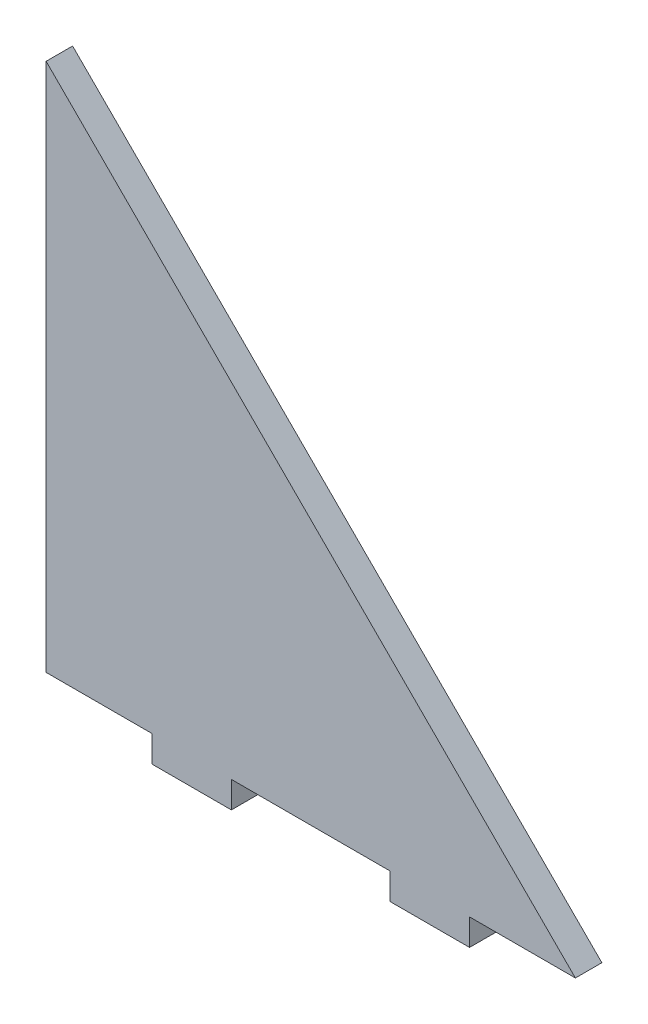
ISO-10303-21;
HEADER;
FILE_DESCRIPTION(('STEP AP214'),'2;1');
FILE_NAME('part.step','',(''),(''),'','','');
FILE_SCHEMA(('AUTOMOTIVE_DESIGN { 1 0 10303 214 1 1 1 1 }'));
ENDSEC;
DATA;
#1=APPLICATION_CONTEXT('core data for automotive mechanical design processes');
#2=APPLICATION_PROTOCOL_DEFINITION('international standard','automotive_design',2000,#1);
#3=PRODUCT_CONTEXT('',#1,'mechanical');
#4=PRODUCT('Part','Part','',(#3));
#5=PRODUCT_RELATED_PRODUCT_CATEGORY('part','',(#4));
#6=PRODUCT_DEFINITION_FORMATION('','',#4);
#7=PRODUCT_DEFINITION_CONTEXT('part definition',#1,'design');
#8=PRODUCT_DEFINITION('design','',#6,#7);
#9=PRODUCT_DEFINITION_SHAPE('','',#8);
#10=(LENGTH_UNIT() NAMED_UNIT(*) SI_UNIT(.MILLI.,.METRE.));
#11=(NAMED_UNIT(*) PLANE_ANGLE_UNIT() SI_UNIT($,.RADIAN.));
#12=(NAMED_UNIT(*) SI_UNIT($,.STERADIAN.) SOLID_ANGLE_UNIT());
#13=UNCERTAINTY_MEASURE_WITH_UNIT(LENGTH_MEASURE(1.E-05),#10,'distance_accuracy_value','');
#14=(GEOMETRIC_REPRESENTATION_CONTEXT(3) GLOBAL_UNCERTAINTY_ASSIGNED_CONTEXT((#13)) GLOBAL_UNIT_ASSIGNED_CONTEXT((#10,
#11,#12)) REPRESENTATION_CONTEXT('',''));
#15=CARTESIAN_POINT('',(0.,0.,0.));
#16=DIRECTION('',(0.,0.,1.));
#17=DIRECTION('',(1.,0.,0.));
#18=AXIS2_PLACEMENT_3D('',#15,#16,#17);
#19=CARTESIAN_POINT('',(100.,0.,5.));
#20=DIRECTION('',(-0.707106781186551,-0.707106781186544,0.));
#21=DIRECTION('',(0.707106781186544,-0.707106781186551,0.));
#22=AXIS2_PLACEMENT_3D('',#19,#20,#21);
#23=PLANE('',#22);
#24=DIRECTION('',(-0.707106781186544,0.707106781186551,0.));
#25=VECTOR('',#24,1.);
#26=CARTESIAN_POINT('',(100.,0.,0.));
#27=LINE('',#26,#25);
#28=CARTESIAN_POINT('',(100.,0.,0.));
#29=VERTEX_POINT('',#28);
#30=CARTESIAN_POINT('',(0.,100.000000000001,0.));
#31=VERTEX_POINT('',#30);
#32=EDGE_CURVE('E145',#29,#31,#27,.T.);
#33=ORIENTED_EDGE('',*,*,#32,.T.);
#34=DIRECTION('',(0.,0.,-1.));
#35=VECTOR('',#34,1.);
#36=CARTESIAN_POINT('',(0.,100.000000000001,5.));
#37=LINE('',#36,#35);
#38=CARTESIAN_POINT('',(0.,100.000000000001,5.));
#39=VERTEX_POINT('',#38);
#40=EDGE_CURVE('E11',#39,#31,#37,.T.);
#41=ORIENTED_EDGE('',*,*,#40,.F.);
#42=DIRECTION('',(-0.707106781186544,0.707106781186551,0.));
#43=VECTOR('',#42,1.);
#44=CARTESIAN_POINT('',(100.,0.,5.));
#45=LINE('',#44,#43);
#46=CARTESIAN_POINT('',(100.,0.,5.));
#47=VERTEX_POINT('',#46);
#48=EDGE_CURVE('E165',#47,#39,#45,.T.);
#49=ORIENTED_EDGE('',*,*,#48,.F.);
#50=DIRECTION('',(0.,0.,-1.));
#51=VECTOR('',#50,1.);
#52=CARTESIAN_POINT('',(100.,0.,5.));
#53=LINE('',#52,#51);
#54=EDGE_CURVE('E141',#47,#29,#53,.T.);
#55=ORIENTED_EDGE('',*,*,#54,.T.);
#56=EDGE_LOOP('',(#33,#41,#49,#55));
#57=FACE_BOUND('',#56,.T.);
#58=ADVANCED_FACE('F31',(#57),#23,.F.);
#59=CARTESIAN_POINT('',(0.,100.000000000001,5.));
#60=DIRECTION('',(1.,0.,0.));
#61=DIRECTION('',(0.,0.,-1.));
#62=AXIS2_PLACEMENT_3D('',#59,#60,#61);
#63=PLANE('',#62);
#64=DIRECTION('',(0.,-1.,0.));
#65=VECTOR('',#64,1.);
#66=CARTESIAN_POINT('',(0.,100.000000000001,0.));
#67=LINE('',#66,#65);
#68=CARTESIAN_POINT('',(0.,0.,0.));
#69=VERTEX_POINT('',#68);
#70=EDGE_CURVE('E148',#31,#69,#67,.T.);
#71=ORIENTED_EDGE('',*,*,#70,.T.);
#72=DIRECTION('',(0.,0.,-1.));
#73=VECTOR('',#72,1.);
#74=CARTESIAN_POINT('',(0.,0.,5.));
#75=LINE('',#74,#73);
#76=CARTESIAN_POINT('',(0.,0.,5.));
#77=VERTEX_POINT('',#76);
#78=EDGE_CURVE('E39',#77,#69,#75,.T.);
#79=ORIENTED_EDGE('',*,*,#78,.F.);
#80=DIRECTION('',(0.,-1.,0.));
#81=VECTOR('',#80,1.);
#82=CARTESIAN_POINT('',(0.,100.000000000001,5.));
#83=LINE('',#82,#81);
#84=EDGE_CURVE('E99',#39,#77,#83,.T.);
#85=ORIENTED_EDGE('',*,*,#84,.F.);
#86=ORIENTED_EDGE('',*,*,#40,.T.);
#87=EDGE_LOOP('',(#71,#79,#85,#86));
#88=FACE_BOUND('',#87,.T.);
#89=ADVANCED_FACE('F237',(#88),#63,.F.);
#90=CARTESIAN_POINT('',(0.,0.,5.));
#91=DIRECTION('',(0.,1.,0.));
#92=DIRECTION('',(0.,0.,1.));
#93=AXIS2_PLACEMENT_3D('',#90,#91,#92);
#94=PLANE('',#93);
#95=DIRECTION('',(1.,0.,0.));
#96=VECTOR('',#95,1.);
#97=CARTESIAN_POINT('',(0.,0.,0.));
#98=LINE('',#97,#96);
#99=CARTESIAN_POINT('',(20.,0.,0.));
#100=VERTEX_POINT('',#99);
#101=EDGE_CURVE('E150',#69,#100,#98,.T.);
#102=ORIENTED_EDGE('',*,*,#101,.T.);
#103=DIRECTION('',(0.,0.,-1.));
#104=VECTOR('',#103,1.);
#105=CARTESIAN_POINT('',(20.,0.,5.));
#106=LINE('',#105,#104);
#107=CARTESIAN_POINT('',(20.,0.,5.));
#108=VERTEX_POINT('',#107);
#109=EDGE_CURVE('E181',#108,#100,#106,.T.);
#110=ORIENTED_EDGE('',*,*,#109,.F.);
#111=DIRECTION('',(1.,0.,0.));
#112=VECTOR('',#111,1.);
#113=CARTESIAN_POINT('',(0.,0.,5.));
#114=LINE('',#113,#112);
#115=EDGE_CURVE('E189',#77,#108,#114,.T.);
#116=ORIENTED_EDGE('',*,*,#115,.F.);
#117=ORIENTED_EDGE('',*,*,#78,.T.);
#118=EDGE_LOOP('',(#102,#110,#116,#117));
#119=FACE_BOUND('',#118,.T.);
#120=ADVANCED_FACE('F187',(#119),#94,.F.);
#121=CARTESIAN_POINT('',(20.,0.,5.));
#122=DIRECTION('',(1.,0.,0.));
#123=DIRECTION('',(0.,0.,-1.));
#124=AXIS2_PLACEMENT_3D('',#121,#122,#123);
#125=PLANE('',#124);
#126=DIRECTION('',(0.,-1.,0.));
#127=VECTOR('',#126,1.);
#128=CARTESIAN_POINT('',(20.,0.,0.));
#129=LINE('',#128,#127);
#130=CARTESIAN_POINT('',(20.,-5.,0.));
#131=VERTEX_POINT('',#130);
#132=EDGE_CURVE('E152',#100,#131,#129,.T.);
#133=ORIENTED_EDGE('',*,*,#132,.T.);
#134=DIRECTION('',(0.,0.,-1.));
#135=VECTOR('',#134,1.);
#136=CARTESIAN_POINT('',(20.,-5.,5.));
#137=LINE('',#136,#135);
#138=CARTESIAN_POINT('',(20.,-5.,5.));
#139=VERTEX_POINT('',#138);
#140=EDGE_CURVE('E178',#139,#131,#137,.T.);
#141=ORIENTED_EDGE('',*,*,#140,.F.);
#142=DIRECTION('',(0.,-1.,0.));
#143=VECTOR('',#142,1.);
#144=CARTESIAN_POINT('',(20.,0.,5.));
#145=LINE('',#144,#143);
#146=EDGE_CURVE('E207',#108,#139,#145,.T.);
#147=ORIENTED_EDGE('',*,*,#146,.F.);
#148=ORIENTED_EDGE('',*,*,#109,.T.);
#149=EDGE_LOOP('',(#133,#141,#147,#148));
#150=FACE_BOUND('',#149,.T.);
#151=ADVANCED_FACE('F198',(#150),#125,.F.);
#152=CARTESIAN_POINT('',(20.,-5.,5.));
#153=DIRECTION('',(0.,1.,0.));
#154=DIRECTION('',(0.,0.,1.));
#155=AXIS2_PLACEMENT_3D('',#152,#153,#154);
#156=PLANE('',#155);
#157=DIRECTION('',(1.,0.,0.));
#158=VECTOR('',#157,1.);
#159=CARTESIAN_POINT('',(20.,-5.,0.));
#160=LINE('',#159,#158);
#161=CARTESIAN_POINT('',(35.,-5.,0.));
#162=VERTEX_POINT('',#161);
#163=EDGE_CURVE('E154',#131,#162,#160,.T.);
#164=ORIENTED_EDGE('',*,*,#163,.T.);
#165=DIRECTION('',(0.,0.,-1.));
#166=VECTOR('',#165,1.);
#167=CARTESIAN_POINT('',(35.,-5.,5.));
#168=LINE('',#167,#166);
#169=CARTESIAN_POINT('',(35.,-5.,5.));
#170=VERTEX_POINT('',#169);
#171=EDGE_CURVE('E175',#170,#162,#168,.T.);
#172=ORIENTED_EDGE('',*,*,#171,.F.);
#173=DIRECTION('',(1.,0.,0.));
#174=VECTOR('',#173,1.);
#175=CARTESIAN_POINT('',(20.,-5.,5.));
#176=LINE('',#175,#174);
#177=EDGE_CURVE('E204',#139,#170,#176,.T.);
#178=ORIENTED_EDGE('',*,*,#177,.F.);
#179=ORIENTED_EDGE('',*,*,#140,.T.);
#180=EDGE_LOOP('',(#164,#172,#178,#179));
#181=FACE_BOUND('',#180,.T.);
#182=ADVANCED_FACE('F202',(#181),#156,.F.);
#183=CARTESIAN_POINT('',(35.,0.,5.));
#184=DIRECTION('',(-1.,0.,0.));
#185=DIRECTION('',(0.,0.,1.));
#186=AXIS2_PLACEMENT_3D('',#183,#184,#185);
#187=PLANE('',#186);
#188=DIRECTION('',(0.,1.,0.));
#189=VECTOR('',#188,1.);
#190=CARTESIAN_POINT('',(35.,0.,0.));
#191=LINE('',#190,#189);
#192=CARTESIAN_POINT('',(35.,0.,0.));
#193=VERTEX_POINT('',#192);
#194=EDGE_CURVE('E156',#162,#193,#191,.T.);
#195=ORIENTED_EDGE('',*,*,#194,.T.);
#196=DIRECTION('',(0.,0.,-1.));
#197=VECTOR('',#196,1.);
#198=CARTESIAN_POINT('',(35.,0.,5.));
#199=LINE('',#198,#197);
#200=CARTESIAN_POINT('',(35.,0.,5.));
#201=VERTEX_POINT('',#200);
#202=EDGE_CURVE('E172',#201,#193,#199,.T.);
#203=ORIENTED_EDGE('',*,*,#202,.F.);
#204=DIRECTION('',(0.,1.,0.));
#205=VECTOR('',#204,1.);
#206=CARTESIAN_POINT('',(35.,0.,5.));
#207=LINE('',#206,#205);
#208=EDGE_CURVE('E206',#170,#201,#207,.T.);
#209=ORIENTED_EDGE('',*,*,#208,.F.);
#210=ORIENTED_EDGE('',*,*,#171,.T.);
#211=EDGE_LOOP('',(#195,#203,#209,#210));
#212=FACE_BOUND('',#211,.T.);
#213=ADVANCED_FACE('F250',(#212),#187,.F.);
#214=CARTESIAN_POINT('',(35.,0.,5.));
#215=DIRECTION('',(0.,1.,0.));
#216=DIRECTION('',(0.,0.,1.));
#217=AXIS2_PLACEMENT_3D('',#214,#215,#216);
#218=PLANE('',#217);
#219=DIRECTION('',(1.,0.,0.));
#220=VECTOR('',#219,1.);
#221=CARTESIAN_POINT('',(35.,0.,0.));
#222=LINE('',#221,#220);
#223=CARTESIAN_POINT('',(65.,0.,0.));
#224=VERTEX_POINT('',#223);
#225=EDGE_CURVE('E158',#193,#224,#222,.T.);
#226=ORIENTED_EDGE('',*,*,#225,.T.);
#227=DIRECTION('',(0.,0.,-1.));
#228=VECTOR('',#227,1.);
#229=CARTESIAN_POINT('',(65.,0.,5.));
#230=LINE('',#229,#228);
#231=CARTESIAN_POINT('',(65.,0.,5.));
#232=VERTEX_POINT('',#231);
#233=EDGE_CURVE('E169',#232,#224,#230,.T.);
#234=ORIENTED_EDGE('',*,*,#233,.F.);
#235=DIRECTION('',(1.,0.,0.));
#236=VECTOR('',#235,1.);
#237=CARTESIAN_POINT('',(35.,0.,5.));
#238=LINE('',#237,#236);
#239=EDGE_CURVE('E209',#201,#232,#238,.T.);
#240=ORIENTED_EDGE('',*,*,#239,.F.);
#241=ORIENTED_EDGE('',*,*,#202,.T.);
#242=EDGE_LOOP('',(#226,#234,#240,#241));
#243=FACE_BOUND('',#242,.T.);
#244=ADVANCED_FACE('F218',(#243),#218,.F.);
#245=CARTESIAN_POINT('',(65.,0.,5.));
#246=DIRECTION('',(1.,0.,0.));
#247=DIRECTION('',(0.,0.,-1.));
#248=AXIS2_PLACEMENT_3D('',#245,#246,#247);
#249=PLANE('',#248);
#250=DIRECTION('',(0.,-1.,0.));
#251=VECTOR('',#250,1.);
#252=CARTESIAN_POINT('',(65.,0.,0.));
#253=LINE('',#252,#251);
#254=CARTESIAN_POINT('',(65.,-5.,0.));
#255=VERTEX_POINT('',#254);
#256=EDGE_CURVE('E160',#224,#255,#253,.T.);
#257=ORIENTED_EDGE('',*,*,#256,.T.);
#258=DIRECTION('',(0.,0.,-1.));
#259=VECTOR('',#258,1.);
#260=CARTESIAN_POINT('',(65.,-5.,5.));
#261=LINE('',#260,#259);
#262=CARTESIAN_POINT('',(65.,-5.,5.));
#263=VERTEX_POINT('',#262);
#264=EDGE_CURVE('E136',#263,#255,#261,.T.);
#265=ORIENTED_EDGE('',*,*,#264,.F.);
#266=DIRECTION('',(0.,-1.,0.));
#267=VECTOR('',#266,1.);
#268=CARTESIAN_POINT('',(65.,0.,5.));
#269=LINE('',#268,#267);
#270=EDGE_CURVE('E127',#232,#263,#269,.T.);
#271=ORIENTED_EDGE('',*,*,#270,.F.);
#272=ORIENTED_EDGE('',*,*,#233,.T.);
#273=EDGE_LOOP('',(#257,#265,#271,#272));
#274=FACE_BOUND('',#273,.T.);
#275=ADVANCED_FACE('F222',(#274),#249,.F.);
#276=CARTESIAN_POINT('',(65.,-5.,5.));
#277=DIRECTION('',(0.,1.,0.));
#278=DIRECTION('',(0.,0.,1.));
#279=AXIS2_PLACEMENT_3D('',#276,#277,#278);
#280=PLANE('',#279);
#281=DIRECTION('',(1.,0.,0.));
#282=VECTOR('',#281,1.);
#283=CARTESIAN_POINT('',(65.,-5.,0.));
#284=LINE('',#283,#282);
#285=CARTESIAN_POINT('',(80.,-5.,0.));
#286=VERTEX_POINT('',#285);
#287=EDGE_CURVE('E135',#255,#286,#284,.T.);
#288=ORIENTED_EDGE('',*,*,#287,.T.);
#289=DIRECTION('',(0.,0.,-1.));
#290=VECTOR('',#289,1.);
#291=CARTESIAN_POINT('',(80.,-5.,5.));
#292=LINE('',#291,#290);
#293=CARTESIAN_POINT('',(80.,-5.,5.));
#294=VERTEX_POINT('',#293);
#295=EDGE_CURVE('E132',#294,#286,#292,.T.);
#296=ORIENTED_EDGE('',*,*,#295,.F.);
#297=DIRECTION('',(1.,0.,0.));
#298=VECTOR('',#297,1.);
#299=CARTESIAN_POINT('',(65.,-5.,5.));
#300=LINE('',#299,#298);
#301=EDGE_CURVE('E121',#263,#294,#300,.T.);
#302=ORIENTED_EDGE('',*,*,#301,.F.);
#303=ORIENTED_EDGE('',*,*,#264,.T.);
#304=EDGE_LOOP('',(#288,#296,#302,#303));
#305=FACE_BOUND('',#304,.T.);
#306=ADVANCED_FACE('F133',(#305),#280,.F.);
#307=CARTESIAN_POINT('',(80.,0.,5.));
#308=DIRECTION('',(-1.,0.,0.));
#309=DIRECTION('',(0.,0.,1.));
#310=AXIS2_PLACEMENT_3D('',#307,#308,#309);
#311=PLANE('',#310);
#312=DIRECTION('',(0.,1.,0.));
#313=VECTOR('',#312,1.);
#314=CARTESIAN_POINT('',(80.,0.,0.));
#315=LINE('',#314,#313);
#316=CARTESIAN_POINT('',(80.,0.,0.));
#317=VERTEX_POINT('',#316);
#318=EDGE_CURVE('E85',#286,#317,#315,.T.);
#319=ORIENTED_EDGE('',*,*,#318,.T.);
#320=DIRECTION('',(0.,0.,-1.));
#321=VECTOR('',#320,1.);
#322=CARTESIAN_POINT('',(80.,0.,5.));
#323=LINE('',#322,#321);
#324=CARTESIAN_POINT('',(80.,0.,5.));
#325=VERTEX_POINT('',#324);
#326=EDGE_CURVE('E137',#325,#317,#323,.T.);
#327=ORIENTED_EDGE('',*,*,#326,.F.);
#328=DIRECTION('',(0.,1.,0.));
#329=VECTOR('',#328,1.);
#330=CARTESIAN_POINT('',(80.,0.,5.));
#331=LINE('',#330,#329);
#332=EDGE_CURVE('E125',#294,#325,#331,.T.);
#333=ORIENTED_EDGE('',*,*,#332,.F.);
#334=ORIENTED_EDGE('',*,*,#295,.T.);
#335=EDGE_LOOP('',(#319,#327,#333,#334));
#336=FACE_BOUND('',#335,.T.);
#337=ADVANCED_FACE('F139',(#336),#311,.F.);
#338=CARTESIAN_POINT('',(80.,0.,5.));
#339=DIRECTION('',(0.,1.,0.));
#340=DIRECTION('',(0.,0.,1.));
#341=AXIS2_PLACEMENT_3D('',#338,#339,#340);
#342=PLANE('',#341);
#343=DIRECTION('',(1.,0.,0.));
#344=VECTOR('',#343,1.);
#345=CARTESIAN_POINT('',(80.,0.,0.));
#346=LINE('',#345,#344);
#347=EDGE_CURVE('E91',#317,#29,#346,.T.);
#348=ORIENTED_EDGE('',*,*,#347,.T.);
#349=ORIENTED_EDGE('',*,*,#54,.F.);
#350=DIRECTION('',(1.,0.,0.));
#351=VECTOR('',#350,1.);
#352=CARTESIAN_POINT('',(80.,0.,5.));
#353=LINE('',#352,#351);
#354=EDGE_CURVE('E47',#325,#47,#353,.T.);
#355=ORIENTED_EDGE('',*,*,#354,.F.);
#356=ORIENTED_EDGE('',*,*,#326,.T.);
#357=EDGE_LOOP('',(#348,#349,#355,#356));
#358=FACE_BOUND('',#357,.T.);
#359=ADVANCED_FACE('F226',(#358),#342,.F.);
#360=CARTESIAN_POINT('',(0.,100.000000000001,5.));
#361=DIRECTION('',(0.,0.,1.));
#362=DIRECTION('',(1.,0.,0.));
#363=AXIS2_PLACEMENT_3D('',#360,#361,#362);
#364=PLANE('',#363);
#365=ORIENTED_EDGE('',*,*,#48,.T.);
#366=ORIENTED_EDGE('',*,*,#84,.T.);
#367=ORIENTED_EDGE('',*,*,#115,.T.);
#368=ORIENTED_EDGE('',*,*,#146,.T.);
#369=ORIENTED_EDGE('',*,*,#177,.T.);
#370=ORIENTED_EDGE('',*,*,#208,.T.);
#371=ORIENTED_EDGE('',*,*,#239,.T.);
#372=ORIENTED_EDGE('',*,*,#270,.T.);
#373=ORIENTED_EDGE('',*,*,#301,.T.);
#374=ORIENTED_EDGE('',*,*,#332,.T.);
#375=ORIENTED_EDGE('',*,*,#354,.T.);
#376=EDGE_LOOP('',(#365,#366,#367,#368,#369,#370,#371,#372,#373,#374,#375));
#377=FACE_BOUND('',#376,.T.);
#378=ADVANCED_FACE('F123',(#377),#364,.T.);
#379=CARTESIAN_POINT('',(0.,100.000000000001,0.));
#380=DIRECTION('',(0.,0.,1.));
#381=DIRECTION('',(1.,0.,0.));
#382=AXIS2_PLACEMENT_3D('',#379,#380,#381);
#383=PLANE('',#382);
#384=ORIENTED_EDGE('',*,*,#32,.F.);
#385=ORIENTED_EDGE('',*,*,#347,.F.);
#386=ORIENTED_EDGE('',*,*,#318,.F.);
#387=ORIENTED_EDGE('',*,*,#287,.F.);
#388=ORIENTED_EDGE('',*,*,#256,.F.);
#389=ORIENTED_EDGE('',*,*,#225,.F.);
#390=ORIENTED_EDGE('',*,*,#194,.F.);
#391=ORIENTED_EDGE('',*,*,#163,.F.);
#392=ORIENTED_EDGE('',*,*,#132,.F.);
#393=ORIENTED_EDGE('',*,*,#101,.F.);
#394=ORIENTED_EDGE('',*,*,#70,.F.);
#395=EDGE_LOOP('',(#384,#385,#386,#387,#388,#389,#390,#391,#392,#393,#394));
#396=FACE_BOUND('',#395,.T.);
#397=ADVANCED_FACE('F193',(#396),#383,.F.);
#398=CLOSED_SHELL('',(#58,#89,#120,#151,#182,#213,#244,#275,#306,#337,#359,#378,#397));
#399=MANIFOLD_SOLID_BREP('B2',#398);
#400=ADVANCED_BREP_SHAPE_REPRESENTATION('',(#18,#399),#14);
#401=SHAPE_DEFINITION_REPRESENTATION(#9,#400);
ENDSEC;
END-ISO-10303-21;
